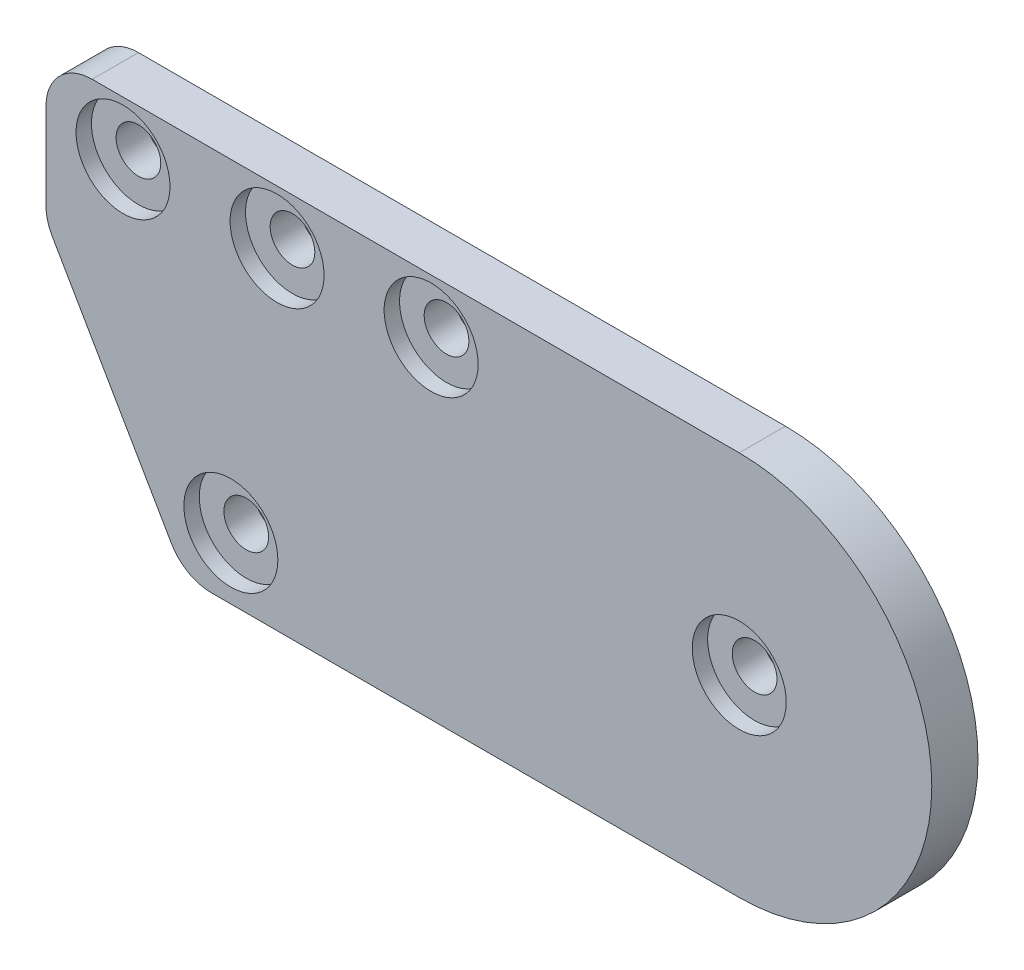
ISO-10303-21;
HEADER;
FILE_DESCRIPTION(('STEP AP214'),'2;1');
FILE_NAME('part.step','',(''),(''),'','','');
FILE_SCHEMA(('AUTOMOTIVE_DESIGN { 1 0 10303 214 1 1 1 1 }'));
ENDSEC;
DATA;
#1=APPLICATION_CONTEXT('core data for automotive mechanical design processes');
#2=APPLICATION_PROTOCOL_DEFINITION('international standard','automotive_design',2000,#1);
#3=PRODUCT_CONTEXT('',#1,'mechanical');
#4=PRODUCT('Part','Part','',(#3));
#5=PRODUCT_RELATED_PRODUCT_CATEGORY('part','',(#4));
#6=PRODUCT_DEFINITION_FORMATION('','',#4);
#7=PRODUCT_DEFINITION_CONTEXT('part definition',#1,'design');
#8=PRODUCT_DEFINITION('design','',#6,#7);
#9=PRODUCT_DEFINITION_SHAPE('','',#8);
#10=(LENGTH_UNIT() NAMED_UNIT(*) SI_UNIT(.MILLI.,.METRE.));
#11=(NAMED_UNIT(*) PLANE_ANGLE_UNIT() SI_UNIT($,.RADIAN.));
#12=(NAMED_UNIT(*) SI_UNIT($,.STERADIAN.) SOLID_ANGLE_UNIT());
#13=UNCERTAINTY_MEASURE_WITH_UNIT(LENGTH_MEASURE(1.E-05),#10,'distance_accuracy_value','');
#14=(GEOMETRIC_REPRESENTATION_CONTEXT(3) GLOBAL_UNCERTAINTY_ASSIGNED_CONTEXT((#13)) GLOBAL_UNIT_ASSIGNED_CONTEXT((#10,
#11,#12)) REPRESENTATION_CONTEXT('',''));
#15=CARTESIAN_POINT('',(0.,0.,0.));
#16=DIRECTION('',(0.,0.,1.));
#17=DIRECTION('',(1.,0.,0.));
#18=AXIS2_PLACEMENT_3D('',#15,#16,#17);
#19=CARTESIAN_POINT('',(35.,-19.5,3.));
#20=DIRECTION('',(0.,0.,-1.));
#21=DIRECTION('',(-1.,0.,0.));
#22=AXIS2_PLACEMENT_3D('',#19,#20,#21);
#23=CYLINDRICAL_SURFACE('',#22,1.45);
#24=CARTESIAN_POINT('',(35.,-19.5,0.));
#25=DIRECTION('',(0.,0.,1.));
#26=DIRECTION('',(1.,0.,0.));
#27=AXIS2_PLACEMENT_3D('',#24,#25,#26);
#28=CIRCLE('',#27,1.45);
#29=CARTESIAN_POINT('',(36.45,-19.5,0.));
#30=VERTEX_POINT('',#29);
#31=EDGE_CURVE('E236',#30,#30,#28,.T.);
#32=ORIENTED_EDGE('',*,*,#31,.F.);
#33=EDGE_LOOP('',(#32));
#34=FACE_BOUND('',#33,.T.);
#35=CARTESIAN_POINT('',(35.,-19.5,2.));
#36=DIRECTION('',(0.,0.,1.));
#37=DIRECTION('',(1.,0.,0.));
#38=AXIS2_PLACEMENT_3D('',#35,#36,#37);
#39=CIRCLE('',#38,1.45);
#40=CARTESIAN_POINT('',(36.45,-19.5,2.));
#41=VERTEX_POINT('',#40);
#42=EDGE_CURVE('E49',#41,#41,#39,.T.);
#43=ORIENTED_EDGE('',*,*,#42,.T.);
#44=EDGE_LOOP('',(#43));
#45=FACE_BOUND('',#44,.T.);
#46=ADVANCED_FACE('F45',(#34,#45),#23,.F.);
#47=CARTESIAN_POINT('',(2.00000000000001,-28.,0.));
#48=DIRECTION('',(0.,0.,1.));
#49=DIRECTION('',(1.,0.,0.));
#50=AXIS2_PLACEMENT_3D('',#47,#48,#49);
#51=CYLINDRICAL_SURFACE('',#50,1.45);
#52=CARTESIAN_POINT('',(2.00000000000001,-28.,0.));
#53=DIRECTION('',(0.,0.,1.));
#54=DIRECTION('',(1.,0.,0.));
#55=AXIS2_PLACEMENT_3D('',#52,#53,#54);
#56=CIRCLE('',#55,1.45);
#57=CARTESIAN_POINT('',(3.45000000000001,-28.,0.));
#58=VERTEX_POINT('',#57);
#59=EDGE_CURVE('E173',#58,#58,#56,.T.);
#60=ORIENTED_EDGE('',*,*,#59,.F.);
#61=EDGE_LOOP('',(#60));
#62=FACE_BOUND('',#61,.T.);
#63=CARTESIAN_POINT('',(2.00000000000001,-28.,2.));
#64=DIRECTION('',(0.,0.,1.));
#65=DIRECTION('',(1.,0.,0.));
#66=AXIS2_PLACEMENT_3D('',#63,#64,#65);
#67=CIRCLE('',#66,1.45);
#68=CARTESIAN_POINT('',(3.45000000000001,-28.,2.));
#69=VERTEX_POINT('',#68);
#70=EDGE_CURVE('E135',#69,#69,#67,.F.);
#71=ORIENTED_EDGE('',*,*,#70,.F.);
#72=EDGE_LOOP('',(#71));
#73=FACE_BOUND('',#72,.T.);
#74=ADVANCED_FACE('F268',(#62,#73),#51,.F.);
#75=CARTESIAN_POINT('',(15.,-10.5,3.));
#76=DIRECTION('',(0.,0.,-1.));
#77=DIRECTION('',(-1.,0.,0.));
#78=AXIS2_PLACEMENT_3D('',#75,#76,#77);
#79=CYLINDRICAL_SURFACE('',#78,1.45);
#80=CARTESIAN_POINT('',(15.,-10.5,0.));
#81=DIRECTION('',(0.,0.,1.));
#82=DIRECTION('',(1.,0.,0.));
#83=AXIS2_PLACEMENT_3D('',#80,#81,#82);
#84=CIRCLE('',#83,1.45);
#85=CARTESIAN_POINT('',(16.45,-10.5,0.));
#86=VERTEX_POINT('',#85);
#87=EDGE_CURVE('E232',#86,#86,#84,.T.);
#88=ORIENTED_EDGE('',*,*,#87,.F.);
#89=EDGE_LOOP('',(#88));
#90=FACE_BOUND('',#89,.T.);
#91=CARTESIAN_POINT('',(15.,-10.5,2.));
#92=DIRECTION('',(0.,0.,1.));
#93=DIRECTION('',(1.,0.,0.));
#94=AXIS2_PLACEMENT_3D('',#91,#92,#93);
#95=CIRCLE('',#94,1.45);
#96=CARTESIAN_POINT('',(16.45,-10.5,2.));
#97=VERTEX_POINT('',#96);
#98=EDGE_CURVE('E169',#97,#97,#95,.T.);
#99=ORIENTED_EDGE('',*,*,#98,.T.);
#100=EDGE_LOOP('',(#99));
#101=FACE_BOUND('',#100,.T.);
#102=ADVANCED_FACE('F275',(#90,#101),#79,.F.);
#103=CARTESIAN_POINT('',(5.,-10.5,3.));
#104=DIRECTION('',(0.,0.,-1.));
#105=DIRECTION('',(-1.,0.,0.));
#106=AXIS2_PLACEMENT_3D('',#103,#104,#105);
#107=CYLINDRICAL_SURFACE('',#106,1.45);
#108=CARTESIAN_POINT('',(5.,-10.5,0.));
#109=DIRECTION('',(0.,0.,1.));
#110=DIRECTION('',(1.,0.,0.));
#111=AXIS2_PLACEMENT_3D('',#108,#109,#110);
#112=CIRCLE('',#111,1.45);
#113=CARTESIAN_POINT('',(6.45,-10.5,0.));
#114=VERTEX_POINT('',#113);
#115=EDGE_CURVE('E228',#114,#114,#112,.T.);
#116=ORIENTED_EDGE('',*,*,#115,.F.);
#117=EDGE_LOOP('',(#116));
#118=FACE_BOUND('',#117,.T.);
#119=CARTESIAN_POINT('',(5.,-10.5,2.));
#120=DIRECTION('',(0.,0.,1.));
#121=DIRECTION('',(1.,0.,0.));
#122=AXIS2_PLACEMENT_3D('',#119,#120,#121);
#123=CIRCLE('',#122,1.45);
#124=CARTESIAN_POINT('',(6.45,-10.5,2.));
#125=VERTEX_POINT('',#124);
#126=EDGE_CURVE('E164',#125,#125,#123,.T.);
#127=ORIENTED_EDGE('',*,*,#126,.T.);
#128=EDGE_LOOP('',(#127));
#129=FACE_BOUND('',#128,.T.);
#130=ADVANCED_FACE('F402',(#118,#129),#107,.F.);
#131=CARTESIAN_POINT('',(-5.,-10.5,3.));
#132=DIRECTION('',(0.,0.,-1.));
#133=DIRECTION('',(-1.,0.,0.));
#134=AXIS2_PLACEMENT_3D('',#131,#132,#133);
#135=CYLINDRICAL_SURFACE('',#134,1.45);
#136=CARTESIAN_POINT('',(-5.,-10.5,0.));
#137=DIRECTION('',(0.,0.,1.));
#138=DIRECTION('',(1.,0.,0.));
#139=AXIS2_PLACEMENT_3D('',#136,#137,#138);
#140=CIRCLE('',#139,1.45);
#141=CARTESIAN_POINT('',(-3.55,-10.5,0.));
#142=VERTEX_POINT('',#141);
#143=EDGE_CURVE('E124',#142,#142,#140,.T.);
#144=ORIENTED_EDGE('',*,*,#143,.F.);
#145=EDGE_LOOP('',(#144));
#146=FACE_BOUND('',#145,.T.);
#147=CARTESIAN_POINT('',(-5.,-10.5,2.));
#148=DIRECTION('',(0.,0.,1.));
#149=DIRECTION('',(1.,0.,0.));
#150=AXIS2_PLACEMENT_3D('',#147,#148,#149);
#151=CIRCLE('',#150,1.45);
#152=CARTESIAN_POINT('',(-3.55,-10.5,2.));
#153=VERTEX_POINT('',#152);
#154=EDGE_CURVE('E160',#153,#153,#151,.T.);
#155=ORIENTED_EDGE('',*,*,#154,.T.);
#156=EDGE_LOOP('',(#155));
#157=FACE_BOUND('',#156,.T.);
#158=ADVANCED_FACE('F284',(#146,#157),#135,.F.);
#159=CARTESIAN_POINT('',(35.,-19.5,3.));
#160=DIRECTION('',(0.,0.,-1.));
#161=DIRECTION('',(-1.,0.,0.));
#162=AXIS2_PLACEMENT_3D('',#159,#160,#161);
#163=PLANE('',#162);
#164=CARTESIAN_POINT('',(35.,-19.5,3.));
#165=DIRECTION('',(0.,0.,1.));
#166=DIRECTION('',(1.,0.,0.));
#167=AXIS2_PLACEMENT_3D('',#164,#165,#166);
#168=CIRCLE('',#167,3.05);
#169=CARTESIAN_POINT('',(38.05,-19.5,3.));
#170=VERTEX_POINT('',#169);
#171=EDGE_CURVE('E449',#170,#170,#168,.T.);
#172=ORIENTED_EDGE('',*,*,#171,.F.);
#173=EDGE_LOOP('',(#172));
#174=FACE_BOUND('',#173,.T.);
#175=CARTESIAN_POINT('',(2.00000000000001,-28.,3.));
#176=DIRECTION('',(0.,0.,1.));
#177=DIRECTION('',(1.,0.,0.));
#178=AXIS2_PLACEMENT_3D('',#175,#176,#177);
#179=CIRCLE('',#178,3.05);
#180=CARTESIAN_POINT('',(5.05000000000001,-28.,3.));
#181=VERTEX_POINT('',#180);
#182=EDGE_CURVE('E439',#181,#181,#179,.T.);
#183=ORIENTED_EDGE('',*,*,#182,.F.);
#184=EDGE_LOOP('',(#183));
#185=FACE_BOUND('',#184,.T.);
#186=DIRECTION('',(-1.,0.,0.));
#187=VECTOR('',#186,1.);
#188=CARTESIAN_POINT('',(-9.99999999999999,-6.99999999999998,3.));
#189=LINE('',#188,#187);
#190=CARTESIAN_POINT('',(35.,-7.,3.));
#191=VERTEX_POINT('',#190);
#192=CARTESIAN_POINT('',(-6.99999999999999,-6.99999999999999,3.));
#193=VERTEX_POINT('',#192);
#194=EDGE_CURVE('E144',#191,#193,#189,.T.);
#195=ORIENTED_EDGE('',*,*,#194,.T.);
#196=CARTESIAN_POINT('',(-6.99999999999999,-9.99999999999998,3.));
#197=DIRECTION('',(0.,0.,-1.));
#198=DIRECTION('',(-1.,0.,0.));
#199=AXIS2_PLACEMENT_3D('',#196,#197,#198);
#200=CIRCLE('',#199,3.);
#201=CARTESIAN_POINT('',(-9.99999999999999,-9.99999999999998,3.));
#202=VERTEX_POINT('',#201);
#203=EDGE_CURVE('E200',#193,#202,#200,.F.);
#204=ORIENTED_EDGE('',*,*,#203,.T.);
#205=DIRECTION('',(0.,-1.,0.));
#206=VECTOR('',#205,1.);
#207=CARTESIAN_POINT('',(-9.99999999999999,-6.99999999999998,3.));
#208=LINE('',#207,#206);
#209=CARTESIAN_POINT('',(-9.99999999999999,-15.6197140366764,3.));
#210=VERTEX_POINT('',#209);
#211=EDGE_CURVE('E150',#202,#210,#208,.T.);
#212=ORIENTED_EDGE('',*,*,#211,.T.);
#213=CARTESIAN_POINT('',(-6.99999999999999,-15.6197140366764,3.));
#214=DIRECTION('',(0.,0.,-1.));
#215=DIRECTION('',(-1.,0.,0.));
#216=AXIS2_PLACEMENT_3D('',#213,#214,#215);
#217=CIRCLE('',#216,3.);
#218=CARTESIAN_POINT('',(-9.59807621135331,-17.1197140366764,3.));
#219=VERTEX_POINT('',#218);
#220=EDGE_CURVE('E70',#210,#219,#217,.F.);
#221=ORIENTED_EDGE('',*,*,#220,.T.);
#222=DIRECTION('',(0.499999999999997,-0.86602540378444,0.));
#223=VECTOR('',#222,1.);
#224=CARTESIAN_POINT('',(-9.99999999999999,-16.4235616139697,3.));
#225=LINE('',#224,#223);
#226=CARTESIAN_POINT('',(-1.8729645085943,-30.5,3.));
#227=VERTEX_POINT('',#226);
#228=EDGE_CURVE('E213',#219,#227,#225,.T.);
#229=ORIENTED_EDGE('',*,*,#228,.T.);
#230=CARTESIAN_POINT('',(0.725111702759017,-29.,3.));
#231=DIRECTION('',(0.,0.,-1.));
#232=DIRECTION('',(-1.,0.,0.));
#233=AXIS2_PLACEMENT_3D('',#230,#231,#232);
#234=CIRCLE('',#233,3.);
#235=CARTESIAN_POINT('',(0.725111702759017,-32.,3.));
#236=VERTEX_POINT('',#235);
#237=EDGE_CURVE('E62',#227,#236,#234,.F.);
#238=ORIENTED_EDGE('',*,*,#237,.T.);
#239=DIRECTION('',(1.,0.,0.));
#240=VECTOR('',#239,1.);
#241=CARTESIAN_POINT('',(-1.00693910480987,-32.,3.));
#242=LINE('',#241,#240);
#243=CARTESIAN_POINT('',(35.0000000000001,-32.,3.));
#244=VERTEX_POINT('',#243);
#245=EDGE_CURVE('E216',#236,#244,#242,.T.);
#246=ORIENTED_EDGE('',*,*,#245,.T.);
#247=CARTESIAN_POINT('',(35.,-19.5,3.));
#248=DIRECTION('',(0.,0.,1.));
#249=DIRECTION('',(-1.,0.,0.));
#250=AXIS2_PLACEMENT_3D('',#247,#248,#249);
#251=CIRCLE('',#250,12.5);
#252=EDGE_CURVE('E132',#244,#191,#251,.T.);
#253=ORIENTED_EDGE('',*,*,#252,.T.);
#254=EDGE_LOOP('',(#195,#204,#212,#221,#229,#238,#246,#253));
#255=FACE_BOUND('',#254,.T.);
#256=CARTESIAN_POINT('',(-5.,-10.5,3.));
#257=DIRECTION('',(0.,0.,1.));
#258=DIRECTION('',(1.,0.,0.));
#259=AXIS2_PLACEMENT_3D('',#256,#257,#258);
#260=CIRCLE('',#259,3.05);
#261=CARTESIAN_POINT('',(-1.95,-10.5,3.));
#262=VERTEX_POINT('',#261);
#263=EDGE_CURVE('E424',#262,#262,#260,.T.);
#264=ORIENTED_EDGE('',*,*,#263,.F.);
#265=EDGE_LOOP('',(#264));
#266=FACE_BOUND('',#265,.T.);
#267=CARTESIAN_POINT('',(5.,-10.5,3.));
#268=DIRECTION('',(0.,0.,1.));
#269=DIRECTION('',(1.,0.,0.));
#270=AXIS2_PLACEMENT_3D('',#267,#268,#269);
#271=CIRCLE('',#270,3.05);
#272=CARTESIAN_POINT('',(8.05,-10.5,3.));
#273=VERTEX_POINT('',#272);
#274=EDGE_CURVE('E418',#273,#273,#271,.T.);
#275=ORIENTED_EDGE('',*,*,#274,.F.);
#276=EDGE_LOOP('',(#275));
#277=FACE_BOUND('',#276,.T.);
#278=CARTESIAN_POINT('',(15.,-10.5,3.));
#279=DIRECTION('',(0.,0.,1.));
#280=DIRECTION('',(1.,0.,0.));
#281=AXIS2_PLACEMENT_3D('',#278,#279,#280);
#282=CIRCLE('',#281,3.05);
#283=CARTESIAN_POINT('',(18.05,-10.5,3.));
#284=VERTEX_POINT('',#283);
#285=EDGE_CURVE('E419',#284,#284,#282,.T.);
#286=ORIENTED_EDGE('',*,*,#285,.F.);
#287=EDGE_LOOP('',(#286));
#288=FACE_BOUND('',#287,.T.);
#289=ADVANCED_FACE('F253',(#174,#185,#255,#266,#277,#288),#163,.F.);
#290=CARTESIAN_POINT('',(35.,-19.5,0.));
#291=DIRECTION('',(0.,0.,-1.));
#292=DIRECTION('',(-1.,0.,0.));
#293=AXIS2_PLACEMENT_3D('',#290,#291,#292);
#294=PLANE('',#293);
#295=DIRECTION('',(0.,-1.,0.));
#296=VECTOR('',#295,1.);
#297=CARTESIAN_POINT('',(-9.99999999999999,-6.99999999999998,0.));
#298=LINE('',#297,#296);
#299=CARTESIAN_POINT('',(-9.99999999999999,-9.99999999999998,0.));
#300=VERTEX_POINT('',#299);
#301=CARTESIAN_POINT('',(-9.99999999999999,-15.6197140366764,0.));
#302=VERTEX_POINT('',#301);
#303=EDGE_CURVE('E145',#300,#302,#298,.T.);
#304=ORIENTED_EDGE('',*,*,#303,.F.);
#305=CARTESIAN_POINT('',(-6.99999999999999,-9.99999999999998,0.));
#306=DIRECTION('',(0.,0.,-1.));
#307=DIRECTION('',(-1.,0.,0.));
#308=AXIS2_PLACEMENT_3D('',#305,#306,#307);
#309=CIRCLE('',#308,3.);
#310=CARTESIAN_POINT('',(-6.99999999999999,-6.99999999999999,0.));
#311=VERTEX_POINT('',#310);
#312=EDGE_CURVE('E190',#300,#311,#309,.T.);
#313=ORIENTED_EDGE('',*,*,#312,.T.);
#314=DIRECTION('',(-1.,0.,0.));
#315=VECTOR('',#314,1.);
#316=CARTESIAN_POINT('',(-9.99999999999999,-6.99999999999998,0.));
#317=LINE('',#316,#315);
#318=CARTESIAN_POINT('',(35.,-7.,0.));
#319=VERTEX_POINT('',#318);
#320=EDGE_CURVE('E142',#319,#311,#317,.T.);
#321=ORIENTED_EDGE('',*,*,#320,.F.);
#322=CARTESIAN_POINT('',(35.,-19.5,0.));
#323=DIRECTION('',(0.,0.,1.));
#324=DIRECTION('',(-1.,0.,0.));
#325=AXIS2_PLACEMENT_3D('',#322,#323,#324);
#326=CIRCLE('',#325,12.5);
#327=CARTESIAN_POINT('',(35.0000000000001,-32.,0.));
#328=VERTEX_POINT('',#327);
#329=EDGE_CURVE('E130',#328,#319,#326,.T.);
#330=ORIENTED_EDGE('',*,*,#329,.F.);
#331=DIRECTION('',(1.,0.,0.));
#332=VECTOR('',#331,1.);
#333=CARTESIAN_POINT('',(-1.00693910480987,-32.,0.));
#334=LINE('',#333,#332);
#335=CARTESIAN_POINT('',(0.725111702759017,-32.,0.));
#336=VERTEX_POINT('',#335);
#337=EDGE_CURVE('E114',#336,#328,#334,.T.);
#338=ORIENTED_EDGE('',*,*,#337,.F.);
#339=CARTESIAN_POINT('',(0.725111702759017,-29.,0.));
#340=DIRECTION('',(0.,0.,-1.));
#341=DIRECTION('',(-1.,0.,0.));
#342=AXIS2_PLACEMENT_3D('',#339,#340,#341);
#343=CIRCLE('',#342,3.);
#344=CARTESIAN_POINT('',(-1.8729645085943,-30.5,0.));
#345=VERTEX_POINT('',#344);
#346=EDGE_CURVE('E184',#336,#345,#343,.T.);
#347=ORIENTED_EDGE('',*,*,#346,.T.);
#348=DIRECTION('',(0.499999999999997,-0.86602540378444,0.));
#349=VECTOR('',#348,1.);
#350=CARTESIAN_POINT('',(-9.99999999999999,-16.4235616139697,0.));
#351=LINE('',#350,#349);
#352=CARTESIAN_POINT('',(-9.59807621135331,-17.1197140366764,0.));
#353=VERTEX_POINT('',#352);
#354=EDGE_CURVE('E125',#353,#345,#351,.T.);
#355=ORIENTED_EDGE('',*,*,#354,.F.);
#356=CARTESIAN_POINT('',(-6.99999999999999,-15.6197140366764,0.));
#357=DIRECTION('',(0.,0.,-1.));
#358=DIRECTION('',(-1.,0.,0.));
#359=AXIS2_PLACEMENT_3D('',#356,#357,#358);
#360=CIRCLE('',#359,3.);
#361=EDGE_CURVE('E187',#353,#302,#360,.T.);
#362=ORIENTED_EDGE('',*,*,#361,.T.);
#363=EDGE_LOOP('',(#304,#313,#321,#330,#338,#347,#355,#362));
#364=FACE_BOUND('',#363,.T.);
#365=ORIENTED_EDGE('',*,*,#115,.T.);
#366=EDGE_LOOP('',(#365));
#367=FACE_BOUND('',#366,.T.);
#368=ORIENTED_EDGE('',*,*,#31,.T.);
#369=EDGE_LOOP('',(#368));
#370=FACE_BOUND('',#369,.T.);
#371=ORIENTED_EDGE('',*,*,#87,.T.);
#372=EDGE_LOOP('',(#371));
#373=FACE_BOUND('',#372,.T.);
#374=ORIENTED_EDGE('',*,*,#143,.T.);
#375=EDGE_LOOP('',(#374));
#376=FACE_BOUND('',#375,.T.);
#377=ORIENTED_EDGE('',*,*,#59,.T.);
#378=EDGE_LOOP('',(#377));
#379=FACE_BOUND('',#378,.T.);
#380=ADVANCED_FACE('F139',(#364,#367,#370,#373,#376,#379),#294,.T.);
#381=CARTESIAN_POINT('',(-9.99999999999999,-6.99999999999998,3.));
#382=DIRECTION('',(0.,-1.,0.));
#383=DIRECTION('',(1.,0.,0.));
#384=AXIS2_PLACEMENT_3D('',#381,#382,#383);
#385=PLANE('',#384);
#386=ORIENTED_EDGE('',*,*,#320,.T.);
#387=DIRECTION('',(0.,0.,-1.));
#388=VECTOR('',#387,1.);
#389=CARTESIAN_POINT('',(-6.99999999999999,-6.99999999999999,3.));
#390=LINE('',#389,#388);
#391=EDGE_CURVE('E193',#311,#193,#390,.F.);
#392=ORIENTED_EDGE('',*,*,#391,.T.);
#393=ORIENTED_EDGE('',*,*,#194,.F.);
#394=DIRECTION('',(0.,0.,-1.));
#395=VECTOR('',#394,1.);
#396=CARTESIAN_POINT('',(35.,-7.,3.));
#397=LINE('',#396,#395);
#398=EDGE_CURVE('E156',#191,#319,#397,.T.);
#399=ORIENTED_EDGE('',*,*,#398,.T.);
#400=EDGE_LOOP('',(#386,#392,#393,#399));
#401=FACE_BOUND('',#400,.T.);
#402=ADVANCED_FACE('F246',(#401),#385,.F.);
#403=CARTESIAN_POINT('',(-9.99999999999999,-6.99999999999998,3.));
#404=DIRECTION('',(1.,0.,0.));
#405=DIRECTION('',(0.,1.,0.));
#406=AXIS2_PLACEMENT_3D('',#403,#404,#405);
#407=PLANE('',#406);
#408=ORIENTED_EDGE('',*,*,#211,.F.);
#409=DIRECTION('',(0.,0.,-1.));
#410=VECTOR('',#409,1.);
#411=CARTESIAN_POINT('',(-9.99999999999999,-9.99999999999998,3.));
#412=LINE('',#411,#410);
#413=EDGE_CURVE('E180',#202,#300,#412,.T.);
#414=ORIENTED_EDGE('',*,*,#413,.T.);
#415=ORIENTED_EDGE('',*,*,#303,.T.);
#416=DIRECTION('',(0.,0.,-1.));
#417=VECTOR('',#416,1.);
#418=CARTESIAN_POINT('',(-9.99999999999999,-15.6197140366764,3.));
#419=LINE('',#418,#417);
#420=EDGE_CURVE('E159',#302,#210,#419,.F.);
#421=ORIENTED_EDGE('',*,*,#420,.T.);
#422=EDGE_LOOP('',(#408,#414,#415,#421));
#423=FACE_BOUND('',#422,.T.);
#424=ADVANCED_FACE('F256',(#423),#407,.F.);
#425=CARTESIAN_POINT('',(35.,-19.5,3.));
#426=DIRECTION('',(0.,0.,-1.));
#427=DIRECTION('',(-1.,0.,0.));
#428=AXIS2_PLACEMENT_3D('',#425,#426,#427);
#429=CYLINDRICAL_SURFACE('',#428,12.5);
#430=ORIENTED_EDGE('',*,*,#252,.F.);
#431=DIRECTION('',(0.,0.,1.));
#432=VECTOR('',#431,1.);
#433=CARTESIAN_POINT('',(35.0000000000001,-32.,0.));
#434=LINE('',#433,#432);
#435=EDGE_CURVE('E118',#328,#244,#434,.T.);
#436=ORIENTED_EDGE('',*,*,#435,.F.);
#437=ORIENTED_EDGE('',*,*,#329,.T.);
#438=ORIENTED_EDGE('',*,*,#398,.F.);
#439=EDGE_LOOP('',(#430,#436,#437,#438));
#440=FACE_BOUND('',#439,.T.);
#441=ADVANCED_FACE('F128',(#440),#429,.T.);
#442=CARTESIAN_POINT('',(-9.99999999999999,-16.4235616139697,0.));
#443=DIRECTION('',(-0.86602540378444,-0.499999999999997,0.));
#444=DIRECTION('',(0.499999999999997,-0.86602540378444,0.));
#445=AXIS2_PLACEMENT_3D('',#442,#443,#444);
#446=PLANE('',#445);
#447=ORIENTED_EDGE('',*,*,#228,.F.);
#448=DIRECTION('',(0.,0.,-1.));
#449=VECTOR('',#448,1.);
#450=CARTESIAN_POINT('',(-9.59807621135331,-17.1197140366764,0.));
#451=LINE('',#450,#449);
#452=EDGE_CURVE('E55',#219,#353,#451,.T.);
#453=ORIENTED_EDGE('',*,*,#452,.T.);
#454=ORIENTED_EDGE('',*,*,#354,.T.);
#455=DIRECTION('',(0.,0.,1.));
#456=VECTOR('',#455,1.);
#457=CARTESIAN_POINT('',(-1.8729645085943,-30.5,0.));
#458=LINE('',#457,#456);
#459=EDGE_CURVE('E203',#345,#227,#458,.T.);
#460=ORIENTED_EDGE('',*,*,#459,.T.);
#461=EDGE_LOOP('',(#447,#453,#454,#460));
#462=FACE_BOUND('',#461,.T.);
#463=ADVANCED_FACE('F212',(#462),#446,.T.);
#464=CARTESIAN_POINT('',(-1.00693910480987,-32.,0.));
#465=DIRECTION('',(0.,-1.,0.));
#466=DIRECTION('',(1.,0.,0.));
#467=AXIS2_PLACEMENT_3D('',#464,#465,#466);
#468=PLANE('',#467);
#469=ORIENTED_EDGE('',*,*,#245,.F.);
#470=DIRECTION('',(0.,0.,1.));
#471=VECTOR('',#470,1.);
#472=CARTESIAN_POINT('',(0.725111702759017,-32.,0.));
#473=LINE('',#472,#471);
#474=EDGE_CURVE('E11',#236,#336,#473,.F.);
#475=ORIENTED_EDGE('',*,*,#474,.T.);
#476=ORIENTED_EDGE('',*,*,#337,.T.);
#477=ORIENTED_EDGE('',*,*,#435,.T.);
#478=EDGE_LOOP('',(#469,#475,#476,#477));
#479=FACE_BOUND('',#478,.T.);
#480=ADVANCED_FACE('F117',(#479),#468,.T.);
#481=CARTESIAN_POINT('',(-5.,-10.5,2.));
#482=DIRECTION('',(0.,0.,1.));
#483=DIRECTION('',(1.,0.,0.));
#484=AXIS2_PLACEMENT_3D('',#481,#482,#483);
#485=CYLINDRICAL_SURFACE('',#484,3.05);
#486=CARTESIAN_POINT('',(-5.,-10.5,2.));
#487=DIRECTION('',(0.,0.,1.));
#488=DIRECTION('',(1.,0.,0.));
#489=AXIS2_PLACEMENT_3D('',#486,#487,#488);
#490=CIRCLE('',#489,3.05);
#491=CARTESIAN_POINT('',(-1.95,-10.5,2.));
#492=VERTEX_POINT('',#491);
#493=EDGE_CURVE('E165',#492,#492,#490,.T.);
#494=ORIENTED_EDGE('',*,*,#493,.F.);
#495=EDGE_LOOP('',(#494));
#496=FACE_BOUND('',#495,.T.);
#497=ORIENTED_EDGE('',*,*,#263,.T.);
#498=EDGE_LOOP('',(#497));
#499=FACE_BOUND('',#498,.T.);
#500=ADVANCED_FACE('F320',(#496,#499),#485,.F.);
#501=CARTESIAN_POINT('',(-5.,-10.5,2.));
#502=DIRECTION('',(0.,0.,1.));
#503=DIRECTION('',(1.,0.,0.));
#504=AXIS2_PLACEMENT_3D('',#501,#502,#503);
#505=PLANE('',#504);
#506=ORIENTED_EDGE('',*,*,#154,.F.);
#507=EDGE_LOOP('',(#506));
#508=FACE_BOUND('',#507,.T.);
#509=ORIENTED_EDGE('',*,*,#493,.T.);
#510=EDGE_LOOP('',(#509));
#511=FACE_BOUND('',#510,.T.);
#512=ADVANCED_FACE('F379',(#508,#511),#505,.T.);
#513=CARTESIAN_POINT('',(5.,-10.5,2.));
#514=DIRECTION('',(0.,0.,1.));
#515=DIRECTION('',(1.,0.,0.));
#516=AXIS2_PLACEMENT_3D('',#513,#514,#515);
#517=CYLINDRICAL_SURFACE('',#516,3.05);
#518=CARTESIAN_POINT('',(5.,-10.5,2.));
#519=DIRECTION('',(0.,0.,1.));
#520=DIRECTION('',(1.,0.,0.));
#521=AXIS2_PLACEMENT_3D('',#518,#519,#520);
#522=CIRCLE('',#521,3.05);
#523=CARTESIAN_POINT('',(8.05,-10.5,2.));
#524=VERTEX_POINT('',#523);
#525=EDGE_CURVE('E416',#524,#524,#522,.T.);
#526=ORIENTED_EDGE('',*,*,#525,.F.);
#527=EDGE_LOOP('',(#526));
#528=FACE_BOUND('',#527,.T.);
#529=ORIENTED_EDGE('',*,*,#274,.T.);
#530=EDGE_LOOP('',(#529));
#531=FACE_BOUND('',#530,.T.);
#532=ADVANCED_FACE('F382',(#528,#531),#517,.F.);
#533=CARTESIAN_POINT('',(5.,-10.5,2.));
#534=DIRECTION('',(0.,0.,1.));
#535=DIRECTION('',(1.,0.,0.));
#536=AXIS2_PLACEMENT_3D('',#533,#534,#535);
#537=PLANE('',#536);
#538=ORIENTED_EDGE('',*,*,#126,.F.);
#539=EDGE_LOOP('',(#538));
#540=FACE_BOUND('',#539,.T.);
#541=ORIENTED_EDGE('',*,*,#525,.T.);
#542=EDGE_LOOP('',(#541));
#543=FACE_BOUND('',#542,.T.);
#544=ADVANCED_FACE('F389',(#540,#543),#537,.T.);
#545=CARTESIAN_POINT('',(15.,-10.5,2.));
#546=DIRECTION('',(0.,0.,1.));
#547=DIRECTION('',(1.,0.,0.));
#548=AXIS2_PLACEMENT_3D('',#545,#546,#547);
#549=CYLINDRICAL_SURFACE('',#548,3.05);
#550=CARTESIAN_POINT('',(15.,-10.5,2.));
#551=DIRECTION('',(0.,0.,1.));
#552=DIRECTION('',(1.,0.,0.));
#553=AXIS2_PLACEMENT_3D('',#550,#551,#552);
#554=CIRCLE('',#553,3.05);
#555=CARTESIAN_POINT('',(18.05,-10.5,2.));
#556=VERTEX_POINT('',#555);
#557=EDGE_CURVE('E134',#556,#556,#554,.T.);
#558=ORIENTED_EDGE('',*,*,#557,.F.);
#559=EDGE_LOOP('',(#558));
#560=FACE_BOUND('',#559,.T.);
#561=ORIENTED_EDGE('',*,*,#285,.T.);
#562=EDGE_LOOP('',(#561));
#563=FACE_BOUND('',#562,.T.);
#564=ADVANCED_FACE('F393',(#560,#563),#549,.F.);
#565=CARTESIAN_POINT('',(15.,-10.5,2.));
#566=DIRECTION('',(0.,0.,1.));
#567=DIRECTION('',(1.,0.,0.));
#568=AXIS2_PLACEMENT_3D('',#565,#566,#567);
#569=PLANE('',#568);
#570=ORIENTED_EDGE('',*,*,#98,.F.);
#571=EDGE_LOOP('',(#570));
#572=FACE_BOUND('',#571,.T.);
#573=ORIENTED_EDGE('',*,*,#557,.T.);
#574=EDGE_LOOP('',(#573));
#575=FACE_BOUND('',#574,.T.);
#576=ADVANCED_FACE('F375',(#572,#575),#569,.T.);
#577=CARTESIAN_POINT('',(2.00000000000001,-28.,2.));
#578=DIRECTION('',(0.,0.,1.));
#579=DIRECTION('',(1.,0.,0.));
#580=AXIS2_PLACEMENT_3D('',#577,#578,#579);
#581=PLANE('',#580);
#582=CARTESIAN_POINT('',(2.00000000000001,-28.,2.));
#583=DIRECTION('',(0.,0.,1.));
#584=DIRECTION('',(1.,0.,0.));
#585=AXIS2_PLACEMENT_3D('',#582,#583,#584);
#586=CIRCLE('',#585,3.05);
#587=CARTESIAN_POINT('',(5.05000000000001,-28.,2.));
#588=VERTEX_POINT('',#587);
#589=EDGE_CURVE('E177',#588,#588,#586,.T.);
#590=ORIENTED_EDGE('',*,*,#589,.T.);
#591=EDGE_LOOP('',(#590));
#592=FACE_BOUND('',#591,.T.);
#593=ORIENTED_EDGE('',*,*,#70,.T.);
#594=EDGE_LOOP('',(#593));
#595=FACE_BOUND('',#594,.T.);
#596=ADVANCED_FACE('F372',(#592,#595),#581,.T.);
#597=CARTESIAN_POINT('',(2.00000000000001,-28.,2.));
#598=DIRECTION('',(0.,0.,1.));
#599=DIRECTION('',(1.,0.,0.));
#600=AXIS2_PLACEMENT_3D('',#597,#598,#599);
#601=CYLINDRICAL_SURFACE('',#600,3.05);
#602=ORIENTED_EDGE('',*,*,#589,.F.);
#603=EDGE_LOOP('',(#602));
#604=FACE_BOUND('',#603,.T.);
#605=ORIENTED_EDGE('',*,*,#182,.T.);
#606=EDGE_LOOP('',(#605));
#607=FACE_BOUND('',#606,.T.);
#608=ADVANCED_FACE('F265',(#604,#607),#601,.F.);
#609=CARTESIAN_POINT('',(-6.99999999999999,-9.99999999999998,3.));
#610=DIRECTION('',(0.,0.,-1.));
#611=DIRECTION('',(-1.,0.,0.));
#612=AXIS2_PLACEMENT_3D('',#609,#610,#611);
#613=CYLINDRICAL_SURFACE('',#612,3.);
#614=ORIENTED_EDGE('',*,*,#203,.F.);
#615=ORIENTED_EDGE('',*,*,#391,.F.);
#616=ORIENTED_EDGE('',*,*,#312,.F.);
#617=ORIENTED_EDGE('',*,*,#413,.F.);
#618=EDGE_LOOP('',(#614,#615,#616,#617));
#619=FACE_BOUND('',#618,.T.);
#620=ADVANCED_FACE('F250',(#619),#613,.T.);
#621=CARTESIAN_POINT('',(-6.99999999999999,-15.6197140366764,0.));
#622=DIRECTION('',(0.,0.,1.));
#623=DIRECTION('',(1.,0.,0.));
#624=AXIS2_PLACEMENT_3D('',#621,#622,#623);
#625=CYLINDRICAL_SURFACE('',#624,3.);
#626=ORIENTED_EDGE('',*,*,#220,.F.);
#627=ORIENTED_EDGE('',*,*,#420,.F.);
#628=ORIENTED_EDGE('',*,*,#361,.F.);
#629=ORIENTED_EDGE('',*,*,#452,.F.);
#630=EDGE_LOOP('',(#626,#627,#628,#629));
#631=FACE_BOUND('',#630,.T.);
#632=ADVANCED_FACE('F258',(#631),#625,.T.);
#633=CARTESIAN_POINT('',(0.725111702759017,-29.,0.));
#634=DIRECTION('',(0.,0.,1.));
#635=DIRECTION('',(1.,0.,0.));
#636=AXIS2_PLACEMENT_3D('',#633,#634,#635);
#637=CYLINDRICAL_SURFACE('',#636,3.);
#638=ORIENTED_EDGE('',*,*,#346,.F.);
#639=ORIENTED_EDGE('',*,*,#474,.F.);
#640=ORIENTED_EDGE('',*,*,#237,.F.);
#641=ORIENTED_EDGE('',*,*,#459,.F.);
#642=EDGE_LOOP('',(#638,#639,#640,#641));
#643=FACE_BOUND('',#642,.T.);
#644=ADVANCED_FACE('F47',(#643),#637,.T.);
#645=CARTESIAN_POINT('',(35.,-19.5,2.));
#646=DIRECTION('',(0.,0.,1.));
#647=DIRECTION('',(1.,0.,0.));
#648=AXIS2_PLACEMENT_3D('',#645,#646,#647);
#649=CYLINDRICAL_SURFACE('',#648,3.05);
#650=CARTESIAN_POINT('',(35.,-19.5,2.));
#651=DIRECTION('',(0.,0.,1.));
#652=DIRECTION('',(1.,0.,0.));
#653=AXIS2_PLACEMENT_3D('',#650,#651,#652);
#654=CIRCLE('',#653,3.05);
#655=CARTESIAN_POINT('',(38.05,-19.5,2.));
#656=VERTEX_POINT('',#655);
#657=EDGE_CURVE('E446',#656,#656,#654,.T.);
#658=ORIENTED_EDGE('',*,*,#657,.F.);
#659=EDGE_LOOP('',(#658));
#660=FACE_BOUND('',#659,.T.);
#661=ORIENTED_EDGE('',*,*,#171,.T.);
#662=EDGE_LOOP('',(#661));
#663=FACE_BOUND('',#662,.T.);
#664=ADVANCED_FACE('F264',(#660,#663),#649,.F.);
#665=CARTESIAN_POINT('',(35.,-19.5,2.));
#666=DIRECTION('',(0.,0.,1.));
#667=DIRECTION('',(1.,0.,0.));
#668=AXIS2_PLACEMENT_3D('',#665,#666,#667);
#669=PLANE('',#668);
#670=ORIENTED_EDGE('',*,*,#42,.F.);
#671=EDGE_LOOP('',(#670));
#672=FACE_BOUND('',#671,.T.);
#673=ORIENTED_EDGE('',*,*,#657,.T.);
#674=EDGE_LOOP('',(#673));
#675=FACE_BOUND('',#674,.T.);
#676=ADVANCED_FACE('F356',(#672,#675),#669,.T.);
#677=CLOSED_SHELL('',(#46,#74,#102,#130,#158,#289,#380,#402,#424,#441,#463,#480,#500,#512,#532,
#544,#564,#576,#596,#608,#620,#632,#644,#664,#676));
#678=MANIFOLD_SOLID_BREP('B2',#677);
#679=ADVANCED_BREP_SHAPE_REPRESENTATION('',(#18,#678),#14);
#680=SHAPE_DEFINITION_REPRESENTATION(#9,#679);
ENDSEC;
END-ISO-10303-21;
